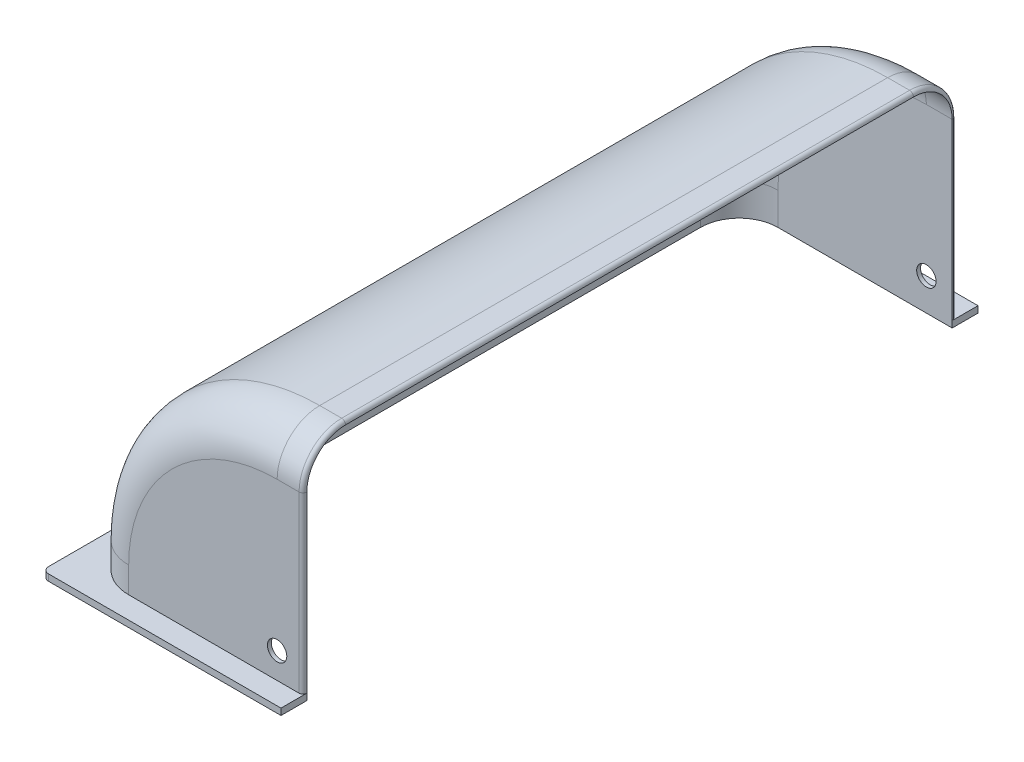
ISO-10303-21;
HEADER;
FILE_DESCRIPTION(('STEP AP214'),'2;1');
FILE_NAME('part.step','',(''),(''),'','','');
FILE_SCHEMA(('AUTOMOTIVE_DESIGN { 1 0 10303 214 1 1 1 1 }'));
ENDSEC;
DATA;
#1=APPLICATION_CONTEXT('core data for automotive mechanical design processes');
#2=APPLICATION_PROTOCOL_DEFINITION('international standard','automotive_design',2000,#1);
#3=PRODUCT_CONTEXT('',#1,'mechanical');
#4=PRODUCT('Part','Part','',(#3));
#5=PRODUCT_RELATED_PRODUCT_CATEGORY('part','',(#4));
#6=PRODUCT_DEFINITION_FORMATION('','',#4);
#7=PRODUCT_DEFINITION_CONTEXT('part definition',#1,'design');
#8=PRODUCT_DEFINITION('design','',#6,#7);
#9=PRODUCT_DEFINITION_SHAPE('','',#8);
#10=(LENGTH_UNIT() NAMED_UNIT(*) SI_UNIT(.MILLI.,.METRE.));
#11=(NAMED_UNIT(*) PLANE_ANGLE_UNIT() SI_UNIT($,.RADIAN.));
#12=(NAMED_UNIT(*) SI_UNIT($,.STERADIAN.) SOLID_ANGLE_UNIT());
#13=UNCERTAINTY_MEASURE_WITH_UNIT(LENGTH_MEASURE(1.E-05),#10,'distance_accuracy_value','');
#14=(GEOMETRIC_REPRESENTATION_CONTEXT(3) GLOBAL_UNCERTAINTY_ASSIGNED_CONTEXT((#13)) GLOBAL_UNIT_ASSIGNED_CONTEXT((#10,
#11,#12)) REPRESENTATION_CONTEXT('',''));
#15=CARTESIAN_POINT('',(0.,0.,0.));
#16=DIRECTION('',(0.,0.,1.));
#17=DIRECTION('',(1.,0.,0.));
#18=AXIS2_PLACEMENT_3D('',#15,#16,#17);
#19=CARTESIAN_POINT('',(20.,139.999999999984,-220.));
#20=DIRECTION('',(1.,0.,0.));
#21=DIRECTION('',(0.,0.,-1.));
#22=AXIS2_PLACEMENT_3D('',#19,#20,#21);
#23=PLANE('',#22);
#24=DIRECTION('',(0.,0.,1.));
#25=VECTOR('',#24,1.);
#26=CARTESIAN_POINT('',(20.,5.,-270.));
#27=LINE('',#26,#25);
#28=CARTESIAN_POINT('',(20.,5.,-270.));
#29=VERTEX_POINT('',#28);
#30=CARTESIAN_POINT('',(20.,5.,-250.));
#31=VERTEX_POINT('',#30);
#32=EDGE_CURVE('E217',#29,#31,#27,.T.);
#33=ORIENTED_EDGE('',*,*,#32,.T.);
#34=DIRECTION('',(0.,-1.,0.));
#35=VECTOR('',#34,1.);
#36=CARTESIAN_POINT('',(20.,24.9999999999842,-249.999999999999));
#37=LINE('',#36,#35);
#38=CARTESIAN_POINT('',(20.,0.,-250.));
#39=VERTEX_POINT('',#38);
#40=EDGE_CURVE('E210',#31,#39,#37,.T.);
#41=ORIENTED_EDGE('',*,*,#40,.T.);
#42=DIRECTION('',(0.,0.,-1.));
#43=VECTOR('',#42,1.);
#44=CARTESIAN_POINT('',(20.,0.,-250.));
#45=LINE('',#44,#43);
#46=CARTESIAN_POINT('',(20.,0.,-270.));
#47=VERTEX_POINT('',#46);
#48=EDGE_CURVE('E214',#39,#47,#45,.T.);
#49=ORIENTED_EDGE('',*,*,#48,.T.);
#50=DIRECTION('',(0.,1.,0.));
#51=VECTOR('',#50,1.);
#52=CARTESIAN_POINT('',(20.,0.,-270.));
#53=LINE('',#52,#51);
#54=EDGE_CURVE('E238',#47,#29,#53,.T.);
#55=ORIENTED_EDGE('',*,*,#54,.T.);
#56=EDGE_LOOP('',(#33,#41,#49,#55));
#57=FACE_BOUND('',#56,.T.);
#58=ADVANCED_FACE('F41',(#57),#23,.T.);
#59=CARTESIAN_POINT('',(-145.,5.,-250.));
#60=DIRECTION('',(0.,0.,-1.));
#61=DIRECTION('',(-1.,0.,0.));
#62=AXIS2_PLACEMENT_3D('',#59,#60,#61);
#63=PLANE('',#62);
#64=CARTESIAN_POINT('',(0.,25.,-250.));
#65=DIRECTION('',(0.,0.,-1.));
#66=DIRECTION('',(-1.,0.,0.));
#67=AXIS2_PLACEMENT_3D('',#64,#65,#66);
#68=CIRCLE('',#67,7.5);
#69=CARTESIAN_POINT('',(-7.5,25.,-250.));
#70=VERTEX_POINT('',#69);
#71=EDGE_CURVE('E223',#70,#70,#68,.T.);
#72=ORIENTED_EDGE('',*,*,#71,.T.);
#73=EDGE_LOOP('',(#72));
#74=FACE_BOUND('',#73,.T.);
#75=DIRECTION('',(1.,0.,0.));
#76=VECTOR('',#75,1.);
#77=CARTESIAN_POINT('',(-145.,0.,-250.));
#78=LINE('',#77,#76);
#79=CARTESIAN_POINT('',(-115.,0.,-250.));
#80=VERTEX_POINT('',#79);
#81=EDGE_CURVE('E227',#80,#39,#78,.T.);
#82=ORIENTED_EDGE('',*,*,#81,.T.);
#83=ORIENTED_EDGE('',*,*,#40,.F.);
#84=CARTESIAN_POINT('',(20.,140.000000000002,-249.999999999999));
#85=VERTEX_POINT('',#84);
#86=EDGE_CURVE('E222',#85,#31,#37,.T.);
#87=ORIENTED_EDGE('',*,*,#86,.F.);
#88=DIRECTION('',(-1.,0.,0.));
#89=VECTOR('',#88,1.);
#90=CARTESIAN_POINT('',(20.,140.000000000002,-249.999999999999));
#91=LINE('',#90,#89);
#92=CARTESIAN_POINT('',(4.02455846426619E-13,140.,-250.));
#93=VERTEX_POINT('',#92);
#94=EDGE_CURVE('E266',#85,#93,#91,.T.);
#95=ORIENTED_EDGE('',*,*,#94,.T.);
#96=CARTESIAN_POINT('',(0.,25.,-250.));
#97=DIRECTION('',(0.,0.,1.));
#98=DIRECTION('',(1.,0.,0.));
#99=AXIS2_PLACEMENT_3D('',#96,#97,#98);
#100=CIRCLE('',#99,115.);
#101=CARTESIAN_POINT('',(-115.,25.,-250.));
#102=VERTEX_POINT('',#101);
#103=EDGE_CURVE('E304',#93,#102,#100,.T.);
#104=ORIENTED_EDGE('',*,*,#103,.T.);
#105=DIRECTION('',(0.,-1.,0.));
#106=VECTOR('',#105,1.);
#107=CARTESIAN_POINT('',(-115.,0.,-250.));
#108=LINE('',#107,#106);
#109=EDGE_CURVE('E230',#102,#80,#108,.T.);
#110=ORIENTED_EDGE('',*,*,#109,.T.);
#111=EDGE_LOOP('',(#82,#83,#87,#95,#104,#110));
#112=FACE_BOUND('',#111,.T.);
#113=ADVANCED_FACE('F228',(#74,#112),#63,.F.);
#114=CARTESIAN_POINT('',(-165.,5.,-270.));
#115=DIRECTION('',(0.,0.,1.));
#116=DIRECTION('',(1.,0.,0.));
#117=AXIS2_PLACEMENT_3D('',#114,#115,#116);
#118=PLANE('',#117);
#119=DIRECTION('',(-1.,0.,0.));
#120=VECTOR('',#119,1.);
#121=CARTESIAN_POINT('',(-165.,0.,-270.));
#122=LINE('',#121,#120);
#123=CARTESIAN_POINT('',(-160.,0.,-270.));
#124=VERTEX_POINT('',#123);
#125=EDGE_CURVE('E232',#47,#124,#122,.T.);
#126=ORIENTED_EDGE('',*,*,#125,.T.);
#127=DIRECTION('',(0.,-1.,0.));
#128=VECTOR('',#127,1.);
#129=CARTESIAN_POINT('',(-160.,5.,-270.));
#130=LINE('',#129,#128);
#131=CARTESIAN_POINT('',(-160.,5.,-270.));
#132=VERTEX_POINT('',#131);
#133=EDGE_CURVE('E407',#124,#132,#130,.F.);
#134=ORIENTED_EDGE('',*,*,#133,.T.);
#135=DIRECTION('',(-1.,0.,0.));
#136=VECTOR('',#135,1.);
#137=CARTESIAN_POINT('',(-165.,5.,-270.));
#138=LINE('',#137,#136);
#139=EDGE_CURVE('E339',#29,#132,#138,.T.);
#140=ORIENTED_EDGE('',*,*,#139,.F.);
#141=ORIENTED_EDGE('',*,*,#54,.F.);
#142=EDGE_LOOP('',(#126,#134,#140,#141));
#143=FACE_BOUND('',#142,.T.);
#144=ADVANCED_FACE('F470',(#143),#118,.F.);
#145=CARTESIAN_POINT('',(-165.,5.,-270.));
#146=DIRECTION('',(1.,0.,0.));
#147=DIRECTION('',(0.,0.,-1.));
#148=AXIS2_PLACEMENT_3D('',#145,#146,#147);
#149=PLANE('',#148);
#150=DIRECTION('',(0.,0.,1.));
#151=VECTOR('',#150,1.);
#152=CARTESIAN_POINT('',(-165.,5.,-270.));
#153=LINE('',#152,#151);
#154=CARTESIAN_POINT('',(-165.,5.,-265.));
#155=VERTEX_POINT('',#154);
#156=CARTESIAN_POINT('',(-165.,5.,265.));
#157=VERTEX_POINT('',#156);
#158=EDGE_CURVE('E342',#155,#157,#153,.T.);
#159=ORIENTED_EDGE('',*,*,#158,.F.);
#160=DIRECTION('',(0.,-1.,0.));
#161=VECTOR('',#160,1.);
#162=CARTESIAN_POINT('',(-165.,5.,-265.));
#163=LINE('',#162,#161);
#164=CARTESIAN_POINT('',(-165.,0.,-265.));
#165=VERTEX_POINT('',#164);
#166=EDGE_CURVE('E400',#155,#165,#163,.T.);
#167=ORIENTED_EDGE('',*,*,#166,.T.);
#168=DIRECTION('',(0.,0.,1.));
#169=VECTOR('',#168,1.);
#170=CARTESIAN_POINT('',(-165.,0.,-270.));
#171=LINE('',#170,#169);
#172=CARTESIAN_POINT('',(-165.,0.,265.));
#173=VERTEX_POINT('',#172);
#174=EDGE_CURVE('E349',#165,#173,#171,.T.);
#175=ORIENTED_EDGE('',*,*,#174,.T.);
#176=DIRECTION('',(0.,-1.,0.));
#177=VECTOR('',#176,1.);
#178=CARTESIAN_POINT('',(-165.,5.,265.));
#179=LINE('',#178,#177);
#180=EDGE_CURVE('E398',#173,#157,#179,.F.);
#181=ORIENTED_EDGE('',*,*,#180,.T.);
#182=EDGE_LOOP('',(#159,#167,#175,#181));
#183=FACE_BOUND('',#182,.T.);
#184=ADVANCED_FACE('F733',(#183),#149,.F.);
#185=CARTESIAN_POINT('',(-165.,5.,270.));
#186=DIRECTION('',(0.,0.,-1.));
#187=DIRECTION('',(-1.,0.,0.));
#188=AXIS2_PLACEMENT_3D('',#185,#186,#187);
#189=PLANE('',#188);
#190=DIRECTION('',(1.,0.,0.));
#191=VECTOR('',#190,1.);
#192=CARTESIAN_POINT('',(-165.,5.,270.));
#193=LINE('',#192,#191);
#194=CARTESIAN_POINT('',(-160.,5.,270.));
#195=VERTEX_POINT('',#194);
#196=CARTESIAN_POINT('',(20.,5.,270.));
#197=VERTEX_POINT('',#196);
#198=EDGE_CURVE('E346',#195,#197,#193,.T.);
#199=ORIENTED_EDGE('',*,*,#198,.F.);
#200=DIRECTION('',(0.,-1.,0.));
#201=VECTOR('',#200,1.);
#202=CARTESIAN_POINT('',(-160.,5.,270.));
#203=LINE('',#202,#201);
#204=CARTESIAN_POINT('',(-160.,0.,270.));
#205=VERTEX_POINT('',#204);
#206=EDGE_CURVE('E413',#195,#205,#203,.T.);
#207=ORIENTED_EDGE('',*,*,#206,.T.);
#208=DIRECTION('',(1.,0.,0.));
#209=VECTOR('',#208,1.);
#210=CARTESIAN_POINT('',(-165.,0.,270.));
#211=LINE('',#210,#209);
#212=CARTESIAN_POINT('',(20.,0.,270.));
#213=VERTEX_POINT('',#212);
#214=EDGE_CURVE('E352',#205,#213,#211,.T.);
#215=ORIENTED_EDGE('',*,*,#214,.T.);
#216=DIRECTION('',(0.,-1.,0.));
#217=VECTOR('',#216,1.);
#218=CARTESIAN_POINT('',(20.,0.,270.));
#219=LINE('',#218,#217);
#220=EDGE_CURVE('E247',#197,#213,#219,.T.);
#221=ORIENTED_EDGE('',*,*,#220,.F.);
#222=EDGE_LOOP('',(#199,#207,#215,#221));
#223=FACE_BOUND('',#222,.T.);
#224=ADVANCED_FACE('F724',(#223),#189,.F.);
#225=CARTESIAN_POINT('',(-145.,5.,250.));
#226=DIRECTION('',(0.,0.,1.));
#227=DIRECTION('',(1.,0.,0.));
#228=AXIS2_PLACEMENT_3D('',#225,#226,#227);
#229=PLANE('',#228);
#230=CARTESIAN_POINT('',(0.,25.,250.));
#231=DIRECTION('',(0.,0.,1.));
#232=DIRECTION('',(1.,0.,0.));
#233=AXIS2_PLACEMENT_3D('',#230,#231,#232);
#234=CIRCLE('',#233,7.5);
#235=CARTESIAN_POINT('',(7.5,25.,250.));
#236=VERTEX_POINT('',#235);
#237=EDGE_CURVE('E444',#236,#236,#234,.T.);
#238=ORIENTED_EDGE('',*,*,#237,.T.);
#239=EDGE_LOOP('',(#238));
#240=FACE_BOUND('',#239,.T.);
#241=DIRECTION('',(-1.,0.,0.));
#242=VECTOR('',#241,1.);
#243=CARTESIAN_POINT('',(-145.,0.,250.));
#244=LINE('',#243,#242);
#245=CARTESIAN_POINT('',(20.,0.,250.));
#246=VERTEX_POINT('',#245);
#247=CARTESIAN_POINT('',(-115.,0.,250.));
#248=VERTEX_POINT('',#247);
#249=EDGE_CURVE('E354',#246,#248,#244,.T.);
#250=ORIENTED_EDGE('',*,*,#249,.T.);
#251=DIRECTION('',(0.,-1.,0.));
#252=VECTOR('',#251,1.);
#253=CARTESIAN_POINT('',(-115.,25.,250.));
#254=LINE('',#253,#252);
#255=CARTESIAN_POINT('',(-115.,25.,250.));
#256=VERTEX_POINT('',#255);
#257=EDGE_CURVE('E365',#248,#256,#254,.F.);
#258=ORIENTED_EDGE('',*,*,#257,.T.);
#259=CARTESIAN_POINT('',(0.,25.,250.));
#260=DIRECTION('',(0.,0.,1.));
#261=DIRECTION('',(1.,0.,0.));
#262=AXIS2_PLACEMENT_3D('',#259,#260,#261);
#263=CIRCLE('',#262,115.);
#264=CARTESIAN_POINT('',(4.02455846426619E-13,140.,250.));
#265=VERTEX_POINT('',#264);
#266=EDGE_CURVE('E312',#265,#256,#263,.T.);
#267=ORIENTED_EDGE('',*,*,#266,.F.);
#268=DIRECTION('',(-1.,0.,0.));
#269=VECTOR('',#268,1.);
#270=CARTESIAN_POINT('',(20.,140.000000000002,250.));
#271=LINE('',#270,#269);
#272=CARTESIAN_POINT('',(20.,140.000000000002,250.));
#273=VERTEX_POINT('',#272);
#274=EDGE_CURVE('E275',#273,#265,#271,.T.);
#275=ORIENTED_EDGE('',*,*,#274,.F.);
#276=DIRECTION('',(0.,1.,0.));
#277=VECTOR('',#276,1.);
#278=CARTESIAN_POINT('',(20.,24.9999999999974,250.));
#279=LINE('',#278,#277);
#280=CARTESIAN_POINT('',(20.,5.,250.));
#281=VERTEX_POINT('',#280);
#282=EDGE_CURVE('E253',#281,#273,#279,.T.);
#283=ORIENTED_EDGE('',*,*,#282,.F.);
#284=EDGE_CURVE('E254',#246,#281,#279,.T.);
#285=ORIENTED_EDGE('',*,*,#284,.F.);
#286=EDGE_LOOP('',(#250,#258,#267,#275,#283,#285));
#287=FACE_BOUND('',#286,.T.);
#288=ADVANCED_FACE('F716',(#240,#287),#229,.F.);
#289=CARTESIAN_POINT('',(-145.,5.,250.));
#290=DIRECTION('',(-1.,0.,0.));
#291=DIRECTION('',(0.,0.,1.));
#292=AXIS2_PLACEMENT_3D('',#289,#290,#291);
#293=PLANE('',#292);
#294=DIRECTION('',(0.,0.,-1.));
#295=VECTOR('',#294,1.);
#296=CARTESIAN_POINT('',(-145.,0.,250.));
#297=LINE('',#296,#295);
#298=CARTESIAN_POINT('',(-145.,0.,220.));
#299=VERTEX_POINT('',#298);
#300=CARTESIAN_POINT('',(-145.,0.,-220.));
#301=VERTEX_POINT('',#300);
#302=EDGE_CURVE('E343',#299,#301,#297,.T.);
#303=ORIENTED_EDGE('',*,*,#302,.T.);
#304=DIRECTION('',(0.,-1.,0.));
#305=VECTOR('',#304,1.);
#306=CARTESIAN_POINT('',(-145.,25.,-220.));
#307=LINE('',#306,#305);
#308=CARTESIAN_POINT('',(-145.,25.,-220.));
#309=VERTEX_POINT('',#308);
#310=EDGE_CURVE('E363',#301,#309,#307,.F.);
#311=ORIENTED_EDGE('',*,*,#310,.T.);
#312=DIRECTION('',(0.,0.,-1.));
#313=VECTOR('',#312,1.);
#314=CARTESIAN_POINT('',(-145.,25.,-250.));
#315=LINE('',#314,#313);
#316=CARTESIAN_POINT('',(-145.,25.,220.));
#317=VERTEX_POINT('',#316);
#318=EDGE_CURVE('E233',#317,#309,#315,.T.);
#319=ORIENTED_EDGE('',*,*,#318,.F.);
#320=DIRECTION('',(0.,-1.,0.));
#321=VECTOR('',#320,1.);
#322=CARTESIAN_POINT('',(-145.,0.,220.));
#323=LINE('',#322,#321);
#324=EDGE_CURVE('E360',#317,#299,#323,.T.);
#325=ORIENTED_EDGE('',*,*,#324,.T.);
#326=EDGE_LOOP('',(#303,#311,#319,#325));
#327=FACE_BOUND('',#326,.T.);
#328=ADVANCED_FACE('F536',(#327),#293,.F.);
#329=CARTESIAN_POINT('',(0.,5.,0.));
#330=DIRECTION('',(0.,1.,0.));
#331=DIRECTION('',(0.,0.,1.));
#332=AXIS2_PLACEMENT_3D('',#329,#330,#331);
#333=PLANE('',#332);
#334=ORIENTED_EDGE('',*,*,#139,.T.);
#335=CARTESIAN_POINT('',(-160.,5.,-265.));
#336=DIRECTION('',(0.,1.,0.));
#337=DIRECTION('',(0.,0.,1.));
#338=AXIS2_PLACEMENT_3D('',#335,#336,#337);
#339=CIRCLE('',#338,5.);
#340=EDGE_CURVE('E411',#132,#155,#339,.T.);
#341=ORIENTED_EDGE('',*,*,#340,.T.);
#342=ORIENTED_EDGE('',*,*,#158,.T.);
#343=CARTESIAN_POINT('',(-160.,5.,265.));
#344=DIRECTION('',(0.,1.,0.));
#345=DIRECTION('',(0.,0.,1.));
#346=AXIS2_PLACEMENT_3D('',#343,#344,#345);
#347=CIRCLE('',#346,5.);
#348=EDGE_CURVE('E409',#157,#195,#347,.T.);
#349=ORIENTED_EDGE('',*,*,#348,.T.);
#350=ORIENTED_EDGE('',*,*,#198,.T.);
#351=DIRECTION('',(0.,0.,1.));
#352=VECTOR('',#351,1.);
#353=CARTESIAN_POINT('',(20.,5.,270.));
#354=LINE('',#353,#352);
#355=EDGE_CURVE('E244',#281,#197,#354,.T.);
#356=ORIENTED_EDGE('',*,*,#355,.F.);
#357=CARTESIAN_POINT('',(17.,5.,250.));
#358=DIRECTION('',(0.,1.,0.));
#359=DIRECTION('',(0.,0.,1.));
#360=AXIS2_PLACEMENT_3D('',#357,#358,#359);
#361=CIRCLE('',#360,3.);
#362=CARTESIAN_POINT('',(17.,5.,253.));
#363=VERTEX_POINT('',#362);
#364=EDGE_CURVE('E11',#281,#363,#361,.F.);
#365=ORIENTED_EDGE('',*,*,#364,.T.);
#366=DIRECTION('',(1.,0.,0.));
#367=VECTOR('',#366,1.);
#368=CARTESIAN_POINT('',(-1.11022302462516E-13,5.,253.));
#369=LINE('',#368,#367);
#370=CARTESIAN_POINT('',(-115.,5.,253.));
#371=VERTEX_POINT('',#370);
#372=EDGE_CURVE('E331',#371,#363,#369,.T.);
#373=ORIENTED_EDGE('',*,*,#372,.F.);
#374=CARTESIAN_POINT('',(-115.,5.,220.));
#375=DIRECTION('',(0.,1.,0.));
#376=DIRECTION('',(0.,0.,1.));
#377=AXIS2_PLACEMENT_3D('',#374,#375,#376);
#378=CIRCLE('',#377,33.);
#379=CARTESIAN_POINT('',(-148.,5.,220.));
#380=VERTEX_POINT('',#379);
#381=EDGE_CURVE('E393',#371,#380,#378,.F.);
#382=ORIENTED_EDGE('',*,*,#381,.T.);
#383=DIRECTION('',(0.,0.,1.));
#384=VECTOR('',#383,1.);
#385=CARTESIAN_POINT('',(-148.,5.,-253.));
#386=LINE('',#385,#384);
#387=CARTESIAN_POINT('',(-148.,5.,-220.));
#388=VERTEX_POINT('',#387);
#389=EDGE_CURVE('E335',#388,#380,#386,.T.);
#390=ORIENTED_EDGE('',*,*,#389,.F.);
#391=CARTESIAN_POINT('',(-115.,5.,-220.));
#392=DIRECTION('',(0.,1.,0.));
#393=DIRECTION('',(0.,0.,1.));
#394=AXIS2_PLACEMENT_3D('',#391,#392,#393);
#395=CIRCLE('',#394,33.);
#396=CARTESIAN_POINT('',(-115.,5.,-253.));
#397=VERTEX_POINT('',#396);
#398=EDGE_CURVE('E395',#388,#397,#395,.F.);
#399=ORIENTED_EDGE('',*,*,#398,.T.);
#400=DIRECTION('',(-1.,0.,0.));
#401=VECTOR('',#400,1.);
#402=CARTESIAN_POINT('',(-1.11022302462516E-13,5.,-253.));
#403=LINE('',#402,#401);
#404=CARTESIAN_POINT('',(17.,5.,-253.));
#405=VERTEX_POINT('',#404);
#406=EDGE_CURVE('E327',#405,#397,#403,.T.);
#407=ORIENTED_EDGE('',*,*,#406,.F.);
#408=CARTESIAN_POINT('',(17.,5.,-250.));
#409=DIRECTION('',(0.,1.,0.));
#410=DIRECTION('',(0.,0.,1.));
#411=AXIS2_PLACEMENT_3D('',#408,#409,#410);
#412=CIRCLE('',#411,3.);
#413=EDGE_CURVE('E50',#405,#31,#412,.F.);
#414=ORIENTED_EDGE('',*,*,#413,.T.);
#415=ORIENTED_EDGE('',*,*,#32,.F.);
#416=EDGE_LOOP('',(#334,#341,#342,#349,#350,#356,#365,#373,#382,#390,#399,#407,#414,#415));
#417=FACE_BOUND('',#416,.T.);
#418=ADVANCED_FACE('F491',(#417),#333,.T.);
#419=CARTESIAN_POINT('',(0.,0.,0.));
#420=DIRECTION('',(0.,1.,0.));
#421=DIRECTION('',(0.,0.,1.));
#422=AXIS2_PLACEMENT_3D('',#419,#420,#421);
#423=PLANE('',#422);
#424=ORIENTED_EDGE('',*,*,#174,.F.);
#425=CARTESIAN_POINT('',(-160.,0.,-265.));
#426=DIRECTION('',(0.,1.,0.));
#427=DIRECTION('',(0.,0.,1.));
#428=AXIS2_PLACEMENT_3D('',#425,#426,#427);
#429=CIRCLE('',#428,5.);
#430=EDGE_CURVE('E405',#165,#124,#429,.F.);
#431=ORIENTED_EDGE('',*,*,#430,.T.);
#432=ORIENTED_EDGE('',*,*,#125,.F.);
#433=ORIENTED_EDGE('',*,*,#48,.F.);
#434=ORIENTED_EDGE('',*,*,#81,.F.);
#435=CARTESIAN_POINT('',(-115.,0.,-220.));
#436=DIRECTION('',(0.,1.,0.));
#437=DIRECTION('',(0.,0.,1.));
#438=AXIS2_PLACEMENT_3D('',#435,#436,#437);
#439=CIRCLE('',#438,30.);
#440=EDGE_CURVE('E367',#80,#301,#439,.T.);
#441=ORIENTED_EDGE('',*,*,#440,.T.);
#442=ORIENTED_EDGE('',*,*,#302,.F.);
#443=CARTESIAN_POINT('',(-115.,0.,220.));
#444=DIRECTION('',(0.,1.,0.));
#445=DIRECTION('',(0.,0.,1.));
#446=AXIS2_PLACEMENT_3D('',#443,#444,#445);
#447=CIRCLE('',#446,30.);
#448=EDGE_CURVE('E372',#299,#248,#447,.T.);
#449=ORIENTED_EDGE('',*,*,#448,.T.);
#450=ORIENTED_EDGE('',*,*,#249,.F.);
#451=DIRECTION('',(0.,0.,-1.));
#452=VECTOR('',#451,1.);
#453=CARTESIAN_POINT('',(20.,0.,250.));
#454=LINE('',#453,#452);
#455=EDGE_CURVE('E250',#213,#246,#454,.T.);
#456=ORIENTED_EDGE('',*,*,#455,.F.);
#457=ORIENTED_EDGE('',*,*,#214,.F.);
#458=CARTESIAN_POINT('',(-160.,0.,265.));
#459=DIRECTION('',(0.,1.,0.));
#460=DIRECTION('',(0.,0.,1.));
#461=AXIS2_PLACEMENT_3D('',#458,#459,#460);
#462=CIRCLE('',#461,5.);
#463=EDGE_CURVE('E403',#205,#173,#462,.F.);
#464=ORIENTED_EDGE('',*,*,#463,.T.);
#465=EDGE_LOOP('',(#424,#431,#432,#433,#434,#441,#442,#449,#450,#456,#457,#464));
#466=FACE_BOUND('',#465,.T.);
#467=ADVANCED_FACE('F236',(#466),#423,.F.);
#468=CARTESIAN_POINT('',(-1.11022302462516E-13,25.,-253.));
#469=DIRECTION('',(0.,0.,1.));
#470=DIRECTION('',(1.,0.,0.));
#471=AXIS2_PLACEMENT_3D('',#468,#469,#470);
#472=PLANE('',#471);
#473=CARTESIAN_POINT('',(0.,25.,-253.));
#474=DIRECTION('',(0.,0.,1.));
#475=DIRECTION('',(1.,0.,0.));
#476=AXIS2_PLACEMENT_3D('',#473,#474,#475);
#477=CIRCLE('',#476,7.5);
#478=CARTESIAN_POINT('',(7.5,25.,-253.));
#479=VERTEX_POINT('',#478);
#480=EDGE_CURVE('E439',#479,#479,#477,.F.);
#481=ORIENTED_EDGE('',*,*,#480,.F.);
#482=EDGE_LOOP('',(#481));
#483=FACE_BOUND('',#482,.T.);
#484=DIRECTION('',(-1.,0.,0.));
#485=VECTOR('',#484,1.);
#486=CARTESIAN_POINT('',(20.,139.999999999984,-253.000000000002));
#487=LINE('',#486,#485);
#488=CARTESIAN_POINT('',(17.,139.999999999984,-253.000000000002));
#489=VERTEX_POINT('',#488);
#490=CARTESIAN_POINT('',(4.02455846426619E-13,140.,-253.));
#491=VERTEX_POINT('',#490);
#492=EDGE_CURVE('E284',#489,#491,#487,.T.);
#493=ORIENTED_EDGE('',*,*,#492,.F.);
#494=DIRECTION('',(0.,1.,0.));
#495=VECTOR('',#494,1.);
#496=CARTESIAN_POINT('',(17.,5.,-253.));
#497=LINE('',#496,#495);
#498=EDGE_CURVE('E416',#489,#405,#497,.F.);
#499=ORIENTED_EDGE('',*,*,#498,.T.);
#500=ORIENTED_EDGE('',*,*,#406,.T.);
#501=DIRECTION('',(0.,-1.,0.));
#502=VECTOR('',#501,1.);
#503=CARTESIAN_POINT('',(-115.,25.,-253.));
#504=LINE('',#503,#502);
#505=CARTESIAN_POINT('',(-115.,25.,-253.));
#506=VERTEX_POINT('',#505);
#507=EDGE_CURVE('E391',#397,#506,#504,.F.);
#508=ORIENTED_EDGE('',*,*,#507,.T.);
#509=CARTESIAN_POINT('',(0.,25.,-253.));
#510=DIRECTION('',(0.,0.,1.));
#511=DIRECTION('',(1.,0.,0.));
#512=AXIS2_PLACEMENT_3D('',#509,#510,#511);
#513=CIRCLE('',#512,115.);
#514=EDGE_CURVE('E324',#491,#506,#513,.T.);
#515=ORIENTED_EDGE('',*,*,#514,.F.);
#516=EDGE_LOOP('',(#493,#499,#500,#508,#515));
#517=FACE_BOUND('',#516,.T.);
#518=ADVANCED_FACE('F682',(#483,#517),#472,.F.);
#519=CARTESIAN_POINT('',(-148.,25.,-253.));
#520=DIRECTION('',(1.,0.,0.));
#521=DIRECTION('',(0.,0.,-1.));
#522=AXIS2_PLACEMENT_3D('',#519,#520,#521);
#523=PLANE('',#522);
#524=ORIENTED_EDGE('',*,*,#389,.T.);
#525=DIRECTION('',(0.,-1.,0.));
#526=VECTOR('',#525,1.);
#527=CARTESIAN_POINT('',(-148.,25.,220.));
#528=LINE('',#527,#526);
#529=CARTESIAN_POINT('',(-148.,25.,220.));
#530=VERTEX_POINT('',#529);
#531=EDGE_CURVE('E383',#380,#530,#528,.F.);
#532=ORIENTED_EDGE('',*,*,#531,.T.);
#533=DIRECTION('',(0.,0.,1.));
#534=VECTOR('',#533,1.);
#535=CARTESIAN_POINT('',(-148.,25.,-253.));
#536=LINE('',#535,#534);
#537=CARTESIAN_POINT('',(-148.,25.,-220.));
#538=VERTEX_POINT('',#537);
#539=EDGE_CURVE('E328',#538,#530,#536,.T.);
#540=ORIENTED_EDGE('',*,*,#539,.F.);
#541=DIRECTION('',(0.,-1.,0.));
#542=VECTOR('',#541,1.);
#543=CARTESIAN_POINT('',(-148.,25.,-220.));
#544=LINE('',#543,#542);
#545=EDGE_CURVE('E380',#538,#388,#544,.T.);
#546=ORIENTED_EDGE('',*,*,#545,.T.);
#547=EDGE_LOOP('',(#524,#532,#540,#546));
#548=FACE_BOUND('',#547,.T.);
#549=ADVANCED_FACE('F500',(#548),#523,.F.);
#550=CARTESIAN_POINT('',(-1.11022302462516E-13,25.,253.));
#551=DIRECTION('',(0.,0.,-1.));
#552=DIRECTION('',(-1.,0.,0.));
#553=AXIS2_PLACEMENT_3D('',#550,#551,#552);
#554=PLANE('',#553);
#555=CARTESIAN_POINT('',(0.,25.,253.));
#556=DIRECTION('',(0.,0.,1.));
#557=DIRECTION('',(1.,0.,0.));
#558=AXIS2_PLACEMENT_3D('',#555,#556,#557);
#559=CIRCLE('',#558,7.5);
#560=CARTESIAN_POINT('',(7.5,25.,253.));
#561=VERTEX_POINT('',#560);
#562=EDGE_CURVE('E435',#561,#561,#559,.T.);
#563=ORIENTED_EDGE('',*,*,#562,.F.);
#564=EDGE_LOOP('',(#563));
#565=FACE_BOUND('',#564,.T.);
#566=ORIENTED_EDGE('',*,*,#372,.T.);
#567=DIRECTION('',(0.,-1.,0.));
#568=VECTOR('',#567,1.);
#569=CARTESIAN_POINT('',(17.,139.999999999998,253.));
#570=LINE('',#569,#568);
#571=CARTESIAN_POINT('',(17.,139.999999999998,253.));
#572=VERTEX_POINT('',#571);
#573=EDGE_CURVE('E66',#363,#572,#570,.F.);
#574=ORIENTED_EDGE('',*,*,#573,.T.);
#575=DIRECTION('',(-1.,0.,0.));
#576=VECTOR('',#575,1.);
#577=CARTESIAN_POINT('',(20.,139.999999999998,253.));
#578=LINE('',#577,#576);
#579=CARTESIAN_POINT('',(4.02455846426619E-13,140.,253.));
#580=VERTEX_POINT('',#579);
#581=EDGE_CURVE('E278',#572,#580,#578,.T.);
#582=ORIENTED_EDGE('',*,*,#581,.T.);
#583=CARTESIAN_POINT('',(0.,25.,253.));
#584=DIRECTION('',(0.,0.,1.));
#585=DIRECTION('',(1.,0.,0.));
#586=AXIS2_PLACEMENT_3D('',#583,#584,#585);
#587=CIRCLE('',#586,115.);
#588=CARTESIAN_POINT('',(-115.,25.,253.));
#589=VERTEX_POINT('',#588);
#590=EDGE_CURVE('E315',#580,#589,#587,.T.);
#591=ORIENTED_EDGE('',*,*,#590,.T.);
#592=DIRECTION('',(0.,-1.,0.));
#593=VECTOR('',#592,1.);
#594=CARTESIAN_POINT('',(-115.,25.,253.));
#595=LINE('',#594,#593);
#596=EDGE_CURVE('E377',#589,#371,#595,.T.);
#597=ORIENTED_EDGE('',*,*,#596,.T.);
#598=EDGE_LOOP('',(#566,#574,#582,#591,#597));
#599=FACE_BOUND('',#598,.T.);
#600=ADVANCED_FACE('F492',(#565,#599),#554,.F.);
#601=CARTESIAN_POINT('',(-115.,5.,-220.));
#602=DIRECTION('',(0.,1.,0.));
#603=DIRECTION('',(0.,0.,1.));
#604=AXIS2_PLACEMENT_3D('',#601,#602,#603);
#605=CYLINDRICAL_SURFACE('',#604,30.);
#606=CARTESIAN_POINT('',(-115.,25.,-220.));
#607=DIRECTION('',(0.,-1.,0.));
#608=DIRECTION('',(0.,0.,-1.));
#609=AXIS2_PLACEMENT_3D('',#606,#607,#608);
#610=CIRCLE('',#609,30.);
#611=EDGE_CURVE('E369',#309,#102,#610,.T.);
#612=ORIENTED_EDGE('',*,*,#611,.F.);
#613=ORIENTED_EDGE('',*,*,#310,.F.);
#614=ORIENTED_EDGE('',*,*,#440,.F.);
#615=ORIENTED_EDGE('',*,*,#109,.F.);
#616=EDGE_LOOP('',(#612,#613,#614,#615));
#617=FACE_BOUND('',#616,.T.);
#618=ADVANCED_FACE('F540',(#617),#605,.F.);
#619=CARTESIAN_POINT('',(-115.,5.,220.));
#620=DIRECTION('',(0.,1.,0.));
#621=DIRECTION('',(0.,0.,1.));
#622=AXIS2_PLACEMENT_3D('',#619,#620,#621);
#623=CYLINDRICAL_SURFACE('',#622,30.);
#624=CARTESIAN_POINT('',(-115.,25.,220.));
#625=DIRECTION('',(0.,-1.,0.));
#626=DIRECTION('',(0.,0.,-1.));
#627=AXIS2_PLACEMENT_3D('',#624,#625,#626);
#628=CIRCLE('',#627,30.);
#629=EDGE_CURVE('E374',#256,#317,#628,.T.);
#630=ORIENTED_EDGE('',*,*,#629,.F.);
#631=ORIENTED_EDGE('',*,*,#257,.F.);
#632=ORIENTED_EDGE('',*,*,#448,.F.);
#633=ORIENTED_EDGE('',*,*,#324,.F.);
#634=EDGE_LOOP('',(#630,#631,#632,#633));
#635=FACE_BOUND('',#634,.T.);
#636=ADVANCED_FACE('F533',(#635),#623,.F.);
#637=CARTESIAN_POINT('',(-115.,25.,220.));
#638=DIRECTION('',(0.,-1.,0.));
#639=DIRECTION('',(0.,0.,-1.));
#640=AXIS2_PLACEMENT_3D('',#637,#638,#639);
#641=CYLINDRICAL_SURFACE('',#640,33.);
#642=CARTESIAN_POINT('',(-115.,25.,220.));
#643=DIRECTION('',(0.,-1.,0.));
#644=DIRECTION('',(0.,0.,-1.));
#645=AXIS2_PLACEMENT_3D('',#642,#643,#644);
#646=CIRCLE('',#645,33.);
#647=EDGE_CURVE('E388',#530,#589,#646,.F.);
#648=ORIENTED_EDGE('',*,*,#647,.F.);
#649=ORIENTED_EDGE('',*,*,#531,.F.);
#650=ORIENTED_EDGE('',*,*,#381,.F.);
#651=ORIENTED_EDGE('',*,*,#596,.F.);
#652=EDGE_LOOP('',(#648,#649,#650,#651));
#653=FACE_BOUND('',#652,.T.);
#654=ADVANCED_FACE('F496',(#653),#641,.T.);
#655=CARTESIAN_POINT('',(-115.,25.,-220.));
#656=DIRECTION('',(0.,-1.,0.));
#657=DIRECTION('',(0.,0.,-1.));
#658=AXIS2_PLACEMENT_3D('',#655,#656,#657);
#659=CYLINDRICAL_SURFACE('',#658,33.);
#660=CARTESIAN_POINT('',(-115.,25.,-220.));
#661=DIRECTION('',(0.,-1.,0.));
#662=DIRECTION('',(0.,0.,-1.));
#663=AXIS2_PLACEMENT_3D('',#660,#661,#662);
#664=CIRCLE('',#663,33.);
#665=EDGE_CURVE('E385',#506,#538,#664,.F.);
#666=ORIENTED_EDGE('',*,*,#665,.F.);
#667=ORIENTED_EDGE('',*,*,#507,.F.);
#668=ORIENTED_EDGE('',*,*,#398,.F.);
#669=ORIENTED_EDGE('',*,*,#545,.F.);
#670=EDGE_LOOP('',(#666,#667,#668,#669));
#671=FACE_BOUND('',#670,.T.);
#672=ADVANCED_FACE('F504',(#671),#659,.T.);
#673=CARTESIAN_POINT('',(-160.,5.,-265.));
#674=DIRECTION('',(0.,-1.,0.));
#675=DIRECTION('',(0.,0.,-1.));
#676=AXIS2_PLACEMENT_3D('',#673,#674,#675);
#677=CYLINDRICAL_SURFACE('',#676,5.);
#678=ORIENTED_EDGE('',*,*,#340,.F.);
#679=ORIENTED_EDGE('',*,*,#133,.F.);
#680=ORIENTED_EDGE('',*,*,#430,.F.);
#681=ORIENTED_EDGE('',*,*,#166,.F.);
#682=EDGE_LOOP('',(#678,#679,#680,#681));
#683=FACE_BOUND('',#682,.T.);
#684=ADVANCED_FACE('F557',(#683),#677,.T.);
#685=CARTESIAN_POINT('',(-160.,5.,265.));
#686=DIRECTION('',(0.,-1.,0.));
#687=DIRECTION('',(0.,0.,-1.));
#688=AXIS2_PLACEMENT_3D('',#685,#686,#687);
#689=CYLINDRICAL_SURFACE('',#688,5.);
#690=ORIENTED_EDGE('',*,*,#348,.F.);
#691=ORIENTED_EDGE('',*,*,#180,.F.);
#692=ORIENTED_EDGE('',*,*,#463,.F.);
#693=ORIENTED_EDGE('',*,*,#206,.F.);
#694=EDGE_LOOP('',(#690,#691,#692,#693));
#695=FACE_BOUND('',#694,.T.);
#696=ADVANCED_FACE('F560',(#695),#689,.T.);
#697=CARTESIAN_POINT('',(0.,25.,-220.));
#698=DIRECTION('',(0.,0.,1.));
#699=DIRECTION('',(1.,0.,0.));
#700=AXIS2_PLACEMENT_3D('',#697,#698,#699);
#701=TOROIDAL_SURFACE('',#700,115.,32.9999999999999);
#702=CARTESIAN_POINT('',(0.,25.,-220.));
#703=DIRECTION('',(0.,0.,1.));
#704=DIRECTION('',(1.,0.,0.));
#705=AXIS2_PLACEMENT_3D('',#702,#703,#704);
#706=CIRCLE('',#705,148.);
#707=CARTESIAN_POINT('',(5.16947595841089E-13,173.,-220.));
#708=VERTEX_POINT('',#707);
#709=EDGE_CURVE('E321',#708,#538,#706,.T.);
#710=ORIENTED_EDGE('',*,*,#709,.F.);
#711=CARTESIAN_POINT('',(4.02455846426619E-13,140.,-220.));
#712=DIRECTION('',(1.,0.,0.));
#713=DIRECTION('',(0.,0.,1.));
#714=AXIS2_PLACEMENT_3D('',#711,#712,#713);
#715=CIRCLE('',#714,32.9999999999999);
#716=EDGE_CURVE('E286',#491,#708,#715,.T.);
#717=ORIENTED_EDGE('',*,*,#716,.F.);
#718=ORIENTED_EDGE('',*,*,#514,.T.);
#719=ORIENTED_EDGE('',*,*,#665,.T.);
#720=EDGE_LOOP('',(#710,#717,#718,#719));
#721=FACE_BOUND('',#720,.T.);
#722=ADVANCED_FACE('F564',(#721),#701,.T.);
#723=CARTESIAN_POINT('',(0.,25.,-250.));
#724=DIRECTION('',(0.,0.,1.));
#725=DIRECTION('',(1.,0.,0.));
#726=AXIS2_PLACEMENT_3D('',#723,#724,#725);
#727=CYLINDRICAL_SURFACE('',#726,148.);
#728=CARTESIAN_POINT('',(0.,25.,220.));
#729=DIRECTION('',(0.,0.,1.));
#730=DIRECTION('',(1.,0.,0.));
#731=AXIS2_PLACEMENT_3D('',#728,#729,#730);
#732=CIRCLE('',#731,148.);
#733=CARTESIAN_POINT('',(5.16947595841089E-13,173.,220.));
#734=VERTEX_POINT('',#733);
#735=EDGE_CURVE('E318',#734,#530,#732,.T.);
#736=ORIENTED_EDGE('',*,*,#735,.F.);
#737=DIRECTION('',(0.,0.,1.));
#738=VECTOR('',#737,1.);
#739=CARTESIAN_POINT('',(5.16947595841089E-13,173.,-220.));
#740=LINE('',#739,#738);
#741=EDGE_CURVE('E289',#708,#734,#740,.T.);
#742=ORIENTED_EDGE('',*,*,#741,.F.);
#743=ORIENTED_EDGE('',*,*,#709,.T.);
#744=ORIENTED_EDGE('',*,*,#539,.T.);
#745=EDGE_LOOP('',(#736,#742,#743,#744));
#746=FACE_BOUND('',#745,.T.);
#747=ADVANCED_FACE('F806',(#746),#727,.T.);
#748=CARTESIAN_POINT('',(0.,25.,220.));
#749=DIRECTION('',(0.,0.,1.));
#750=DIRECTION('',(1.,0.,0.));
#751=AXIS2_PLACEMENT_3D('',#748,#749,#750);
#752=TOROIDAL_SURFACE('',#751,115.,33.);
#753=ORIENTED_EDGE('',*,*,#590,.F.);
#754=CARTESIAN_POINT('',(4.02455846426619E-13,140.,220.));
#755=DIRECTION('',(1.,0.,0.));
#756=DIRECTION('',(0.,0.,-1.));
#757=AXIS2_PLACEMENT_3D('',#754,#755,#756);
#758=CIRCLE('',#757,33.);
#759=EDGE_CURVE('E292',#734,#580,#758,.T.);
#760=ORIENTED_EDGE('',*,*,#759,.F.);
#761=ORIENTED_EDGE('',*,*,#735,.T.);
#762=ORIENTED_EDGE('',*,*,#647,.T.);
#763=EDGE_LOOP('',(#753,#760,#761,#762));
#764=FACE_BOUND('',#763,.T.);
#765=ADVANCED_FACE('F815',(#764),#752,.T.);
#766=CARTESIAN_POINT('',(0.,25.,220.));
#767=DIRECTION('',(0.,0.,1.));
#768=DIRECTION('',(1.,0.,0.));
#769=AXIS2_PLACEMENT_3D('',#766,#767,#768);
#770=TOROIDAL_SURFACE('',#769,115.,30.);
#771=CARTESIAN_POINT('',(0.,25.,220.));
#772=DIRECTION('',(0.,0.,1.));
#773=DIRECTION('',(1.,0.,0.));
#774=AXIS2_PLACEMENT_3D('',#771,#772,#773);
#775=CIRCLE('',#774,145.);
#776=CARTESIAN_POINT('',(5.06539254985228E-13,170.,220.));
#777=VERTEX_POINT('',#776);
#778=EDGE_CURVE('E309',#777,#317,#775,.T.);
#779=ORIENTED_EDGE('',*,*,#778,.F.);
#780=CARTESIAN_POINT('',(4.02455846426619E-13,140.,220.));
#781=DIRECTION('',(-1.,0.,0.));
#782=DIRECTION('',(0.,0.,-1.));
#783=AXIS2_PLACEMENT_3D('',#780,#781,#782);
#784=CIRCLE('',#783,30.);
#785=EDGE_CURVE('E295',#265,#777,#784,.T.);
#786=ORIENTED_EDGE('',*,*,#785,.F.);
#787=ORIENTED_EDGE('',*,*,#266,.T.);
#788=ORIENTED_EDGE('',*,*,#629,.T.);
#789=EDGE_LOOP('',(#779,#786,#787,#788));
#790=FACE_BOUND('',#789,.T.);
#791=ADVANCED_FACE('F528',(#790),#770,.F.);
#792=CARTESIAN_POINT('',(0.,25.,-250.));
#793=DIRECTION('',(0.,0.,1.));
#794=DIRECTION('',(1.,0.,0.));
#795=AXIS2_PLACEMENT_3D('',#792,#793,#794);
#796=CYLINDRICAL_SURFACE('',#795,145.);
#797=CARTESIAN_POINT('',(0.,25.,-220.));
#798=DIRECTION('',(0.,0.,1.));
#799=DIRECTION('',(1.,0.,0.));
#800=AXIS2_PLACEMENT_3D('',#797,#798,#799);
#801=CIRCLE('',#800,145.);
#802=CARTESIAN_POINT('',(5.06539254985228E-13,170.,-220.));
#803=VERTEX_POINT('',#802);
#804=EDGE_CURVE('E306',#803,#309,#801,.T.);
#805=ORIENTED_EDGE('',*,*,#804,.F.);
#806=DIRECTION('',(0.,0.,-1.));
#807=VECTOR('',#806,1.);
#808=CARTESIAN_POINT('',(5.06539254985228E-13,170.,-220.));
#809=LINE('',#808,#807);
#810=EDGE_CURVE('E298',#777,#803,#809,.T.);
#811=ORIENTED_EDGE('',*,*,#810,.F.);
#812=ORIENTED_EDGE('',*,*,#778,.T.);
#813=ORIENTED_EDGE('',*,*,#318,.T.);
#814=EDGE_LOOP('',(#805,#811,#812,#813));
#815=FACE_BOUND('',#814,.T.);
#816=ADVANCED_FACE('F522',(#815),#796,.F.);
#817=CARTESIAN_POINT('',(0.,25.,-220.));
#818=DIRECTION('',(0.,0.,1.));
#819=DIRECTION('',(1.,0.,0.));
#820=AXIS2_PLACEMENT_3D('',#817,#818,#819);
#821=TOROIDAL_SURFACE('',#820,115.,30.);
#822=ORIENTED_EDGE('',*,*,#103,.F.);
#823=CARTESIAN_POINT('',(4.02455846426619E-13,140.,-220.));
#824=DIRECTION('',(-1.,0.,0.));
#825=DIRECTION('',(0.,0.,1.));
#826=AXIS2_PLACEMENT_3D('',#823,#824,#825);
#827=CIRCLE('',#826,30.);
#828=EDGE_CURVE('E301',#803,#93,#827,.T.);
#829=ORIENTED_EDGE('',*,*,#828,.F.);
#830=ORIENTED_EDGE('',*,*,#804,.T.);
#831=ORIENTED_EDGE('',*,*,#611,.T.);
#832=EDGE_LOOP('',(#822,#829,#830,#831));
#833=FACE_BOUND('',#832,.T.);
#834=ADVANCED_FACE('F517',(#833),#821,.F.);
#835=CARTESIAN_POINT('',(20.,139.999999999984,-220.));
#836=DIRECTION('',(-1.,0.,0.));
#837=DIRECTION('',(0.,0.,1.));
#838=AXIS2_PLACEMENT_3D('',#835,#836,#837);
#839=CYLINDRICAL_SURFACE('',#838,33.0000000000023);
#840=DIRECTION('',(-1.,0.,0.));
#841=VECTOR('',#840,1.);
#842=CARTESIAN_POINT('',(20.,172.999999999984,-220.));
#843=LINE('',#842,#841);
#844=CARTESIAN_POINT('',(17.,172.999999999984,-220.));
#845=VERTEX_POINT('',#844);
#846=EDGE_CURVE('E282',#845,#708,#843,.T.);
#847=ORIENTED_EDGE('',*,*,#846,.F.);
#848=CARTESIAN_POINT('',(17.,139.999999999984,-220.));
#849=DIRECTION('',(1.,0.,0.));
#850=DIRECTION('',(0.,0.,-1.));
#851=AXIS2_PLACEMENT_3D('',#848,#849,#850);
#852=CIRCLE('',#851,33.0000000000023);
#853=EDGE_CURVE('E418',#845,#489,#852,.F.);
#854=ORIENTED_EDGE('',*,*,#853,.T.);
#855=ORIENTED_EDGE('',*,*,#492,.T.);
#856=ORIENTED_EDGE('',*,*,#716,.T.);
#857=EDGE_LOOP('',(#847,#854,#855,#856));
#858=FACE_BOUND('',#857,.T.);
#859=ADVANCED_FACE('F655',(#858),#839,.T.);
#860=CARTESIAN_POINT('',(20.,172.999999999984,-220.));
#861=DIRECTION('',(0.,-1.,0.));
#862=DIRECTION('',(0.,0.,-1.));
#863=AXIS2_PLACEMENT_3D('',#860,#861,#862);
#864=PLANE('',#863);
#865=DIRECTION('',(-1.,0.,0.));
#866=VECTOR('',#865,1.);
#867=CARTESIAN_POINT('',(20.,172.999999999984,220.));
#868=LINE('',#867,#866);
#869=CARTESIAN_POINT('',(17.,172.999999999984,220.));
#870=VERTEX_POINT('',#869);
#871=EDGE_CURVE('E280',#870,#734,#868,.T.);
#872=ORIENTED_EDGE('',*,*,#871,.F.);
#873=DIRECTION('',(0.,0.,1.));
#874=VECTOR('',#873,1.);
#875=CARTESIAN_POINT('',(17.,172.999999999984,-220.));
#876=LINE('',#875,#874);
#877=EDGE_CURVE('E422',#870,#845,#876,.F.);
#878=ORIENTED_EDGE('',*,*,#877,.T.);
#879=ORIENTED_EDGE('',*,*,#846,.T.);
#880=ORIENTED_EDGE('',*,*,#741,.T.);
#881=EDGE_LOOP('',(#872,#878,#879,#880));
#882=FACE_BOUND('',#881,.T.);
#883=ADVANCED_FACE('F647',(#882),#864,.F.);
#884=CARTESIAN_POINT('',(20.,139.99999999998,219.999999999995));
#885=DIRECTION('',(-1.,0.,0.));
#886=DIRECTION('',(0.,0.,1.));
#887=AXIS2_PLACEMENT_3D('',#884,#885,#886);
#888=CYLINDRICAL_SURFACE('',#887,33.0000000000044);
#889=ORIENTED_EDGE('',*,*,#581,.F.);
#890=CARTESIAN_POINT('',(17.,139.99999999998,219.999999999995));
#891=DIRECTION('',(1.,0.,0.));
#892=DIRECTION('',(0.,0.,-1.));
#893=AXIS2_PLACEMENT_3D('',#890,#891,#892);
#894=CIRCLE('',#893,33.0000000000044);
#895=EDGE_CURVE('E58',#572,#870,#894,.F.);
#896=ORIENTED_EDGE('',*,*,#895,.T.);
#897=ORIENTED_EDGE('',*,*,#871,.T.);
#898=ORIENTED_EDGE('',*,*,#759,.T.);
#899=EDGE_LOOP('',(#889,#896,#897,#898));
#900=FACE_BOUND('',#899,.T.);
#901=ADVANCED_FACE('F639',(#900),#888,.T.);
#902=CARTESIAN_POINT('',(20.,140.000000000002,220.));
#903=DIRECTION('',(-1.,0.,0.));
#904=DIRECTION('',(0.,0.,1.));
#905=AXIS2_PLACEMENT_3D('',#902,#903,#904);
#906=CYLINDRICAL_SURFACE('',#905,30.);
#907=ORIENTED_EDGE('',*,*,#785,.T.);
#908=DIRECTION('',(-1.,0.,0.));
#909=VECTOR('',#908,1.);
#910=CARTESIAN_POINT('',(20.,170.000000000002,220.));
#911=LINE('',#910,#909);
#912=CARTESIAN_POINT('',(20.,170.000000000002,220.));
#913=VERTEX_POINT('',#912);
#914=EDGE_CURVE('E272',#913,#777,#911,.T.);
#915=ORIENTED_EDGE('',*,*,#914,.F.);
#916=CARTESIAN_POINT('',(20.,140.000000000002,220.));
#917=DIRECTION('',(-1.,0.,0.));
#918=DIRECTION('',(0.,0.,1.));
#919=AXIS2_PLACEMENT_3D('',#916,#917,#918);
#920=CIRCLE('',#919,30.);
#921=EDGE_CURVE('E257',#273,#913,#920,.T.);
#922=ORIENTED_EDGE('',*,*,#921,.F.);
#923=ORIENTED_EDGE('',*,*,#274,.T.);
#924=EDGE_LOOP('',(#907,#915,#922,#923));
#925=FACE_BOUND('',#924,.T.);
#926=ADVANCED_FACE('F525',(#925),#906,.F.);
#927=CARTESIAN_POINT('',(20.,170.000000000002,-219.999999999999));
#928=DIRECTION('',(0.,1.,0.));
#929=DIRECTION('',(0.,0.,1.));
#930=AXIS2_PLACEMENT_3D('',#927,#928,#929);
#931=PLANE('',#930);
#932=ORIENTED_EDGE('',*,*,#810,.T.);
#933=DIRECTION('',(-1.,0.,0.));
#934=VECTOR('',#933,1.);
#935=CARTESIAN_POINT('',(20.,170.000000000002,-219.999999999999));
#936=LINE('',#935,#934);
#937=CARTESIAN_POINT('',(20.,170.000000000002,-219.999999999999));
#938=VERTEX_POINT('',#937);
#939=EDGE_CURVE('E269',#938,#803,#936,.T.);
#940=ORIENTED_EDGE('',*,*,#939,.F.);
#941=DIRECTION('',(0.,0.,-1.));
#942=VECTOR('',#941,1.);
#943=CARTESIAN_POINT('',(20.,170.000000000002,-219.999999999999));
#944=LINE('',#943,#942);
#945=EDGE_CURVE('E260',#913,#938,#944,.T.);
#946=ORIENTED_EDGE('',*,*,#945,.F.);
#947=ORIENTED_EDGE('',*,*,#914,.T.);
#948=EDGE_LOOP('',(#932,#940,#946,#947));
#949=FACE_BOUND('',#948,.T.);
#950=ADVANCED_FACE('F480',(#949),#931,.F.);
#951=CARTESIAN_POINT('',(20.,140.000000000002,-219.999999999999));
#952=DIRECTION('',(-1.,0.,0.));
#953=DIRECTION('',(0.,0.,1.));
#954=AXIS2_PLACEMENT_3D('',#951,#952,#953);
#955=CYLINDRICAL_SURFACE('',#954,30.);
#956=ORIENTED_EDGE('',*,*,#828,.T.);
#957=ORIENTED_EDGE('',*,*,#94,.F.);
#958=CARTESIAN_POINT('',(20.,140.000000000002,-219.999999999999));
#959=DIRECTION('',(-1.,0.,0.));
#960=DIRECTION('',(0.,0.,-1.));
#961=AXIS2_PLACEMENT_3D('',#958,#959,#960);
#962=CIRCLE('',#961,30.);
#963=EDGE_CURVE('E263',#938,#85,#962,.T.);
#964=ORIENTED_EDGE('',*,*,#963,.F.);
#965=ORIENTED_EDGE('',*,*,#939,.T.);
#966=EDGE_LOOP('',(#956,#957,#964,#965));
#967=FACE_BOUND('',#966,.T.);
#968=ADVANCED_FACE('F474',(#967),#955,.F.);
#969=ORIENTED_EDGE('',*,*,#284,.T.);
#970=ORIENTED_EDGE('',*,*,#355,.T.);
#971=ORIENTED_EDGE('',*,*,#220,.T.);
#972=ORIENTED_EDGE('',*,*,#455,.T.);
#973=EDGE_LOOP('',(#969,#970,#971,#972));
#974=FACE_BOUND('',#973,.T.);
#975=ADVANCED_FACE('F464',(#974),#23,.T.);
#976=CARTESIAN_POINT('',(0.,25.,-274.213203435597));
#977=DIRECTION('',(0.,0.,1.));
#978=DIRECTION('',(1.,0.,0.));
#979=AXIS2_PLACEMENT_3D('',#976,#977,#978);
#980=CYLINDRICAL_SURFACE('',#979,7.5);
#981=ORIENTED_EDGE('',*,*,#562,.T.);
#982=EDGE_LOOP('',(#981));
#983=FACE_BOUND('',#982,.T.);
#984=ORIENTED_EDGE('',*,*,#237,.F.);
#985=EDGE_LOOP('',(#984));
#986=FACE_BOUND('',#985,.T.);
#987=ADVANCED_FACE('F454',(#983,#986),#980,.F.);
#988=ORIENTED_EDGE('',*,*,#480,.T.);
#989=EDGE_LOOP('',(#988));
#990=FACE_BOUND('',#989,.T.);
#991=ORIENTED_EDGE('',*,*,#71,.F.);
#992=EDGE_LOOP('',(#991));
#993=FACE_BOUND('',#992,.T.);
#994=ADVANCED_FACE('F452',(#990,#993),#980,.F.);
#995=CARTESIAN_POINT('',(17.,139.999999999984,250.));
#996=DIRECTION('',(0.,1.,0.));
#997=DIRECTION('',(0.,0.,1.));
#998=AXIS2_PLACEMENT_3D('',#995,#996,#997);
#999=CYLINDRICAL_SURFACE('',#998,3.);
#1000=ORIENTED_EDGE('',*,*,#364,.F.);
#1001=ORIENTED_EDGE('',*,*,#282,.T.);
#1002=CARTESIAN_POINT('',(17.,139.999999999998,250.));
#1003=DIRECTION('',(0.,1.,0.));
#1004=DIRECTION('',(0.,0.,1.));
#1005=AXIS2_PLACEMENT_3D('',#1002,#1003,#1004);
#1006=CIRCLE('',#1005,3.);
#1007=EDGE_CURVE('E45',#572,#273,#1006,.T.);
#1008=ORIENTED_EDGE('',*,*,#1007,.F.);
#1009=ORIENTED_EDGE('',*,*,#573,.F.);
#1010=EDGE_LOOP('',(#1000,#1001,#1008,#1009));
#1011=FACE_BOUND('',#1010,.T.);
#1012=ADVANCED_FACE('F43',(#1011),#999,.T.);
#1013=CARTESIAN_POINT('',(17.,139.99999999998,219.999999999995));
#1014=DIRECTION('',(1.,0.,0.));
#1015=DIRECTION('',(0.,0.,-1.));
#1016=AXIS2_PLACEMENT_3D('',#1013,#1014,#1015);
#1017=TOROIDAL_SURFACE('',#1016,30.0000000000044,3.);
#1018=ORIENTED_EDGE('',*,*,#1007,.T.);
#1019=ORIENTED_EDGE('',*,*,#921,.T.);
#1020=CARTESIAN_POINT('',(17.,169.999999999984,220.));
#1021=DIRECTION('',(0.,1.38777878078144E-13,-1.));
#1022=DIRECTION('',(0.,1.,1.38777878078144E-13));
#1023=AXIS2_PLACEMENT_3D('',#1020,#1021,#1022);
#1024=CIRCLE('',#1023,3.);
#1025=EDGE_CURVE('E429',#870,#913,#1024,.T.);
#1026=ORIENTED_EDGE('',*,*,#1025,.F.);
#1027=ORIENTED_EDGE('',*,*,#895,.F.);
#1028=EDGE_LOOP('',(#1018,#1019,#1026,#1027));
#1029=FACE_BOUND('',#1028,.T.);
#1030=ADVANCED_FACE('F462',(#1029),#1017,.T.);
#1031=CARTESIAN_POINT('',(17.,169.999999999984,-220.));
#1032=DIRECTION('',(0.,0.,-1.));
#1033=DIRECTION('',(-1.,0.,0.));
#1034=AXIS2_PLACEMENT_3D('',#1031,#1032,#1033);
#1035=CYLINDRICAL_SURFACE('',#1034,3.);
#1036=ORIENTED_EDGE('',*,*,#1025,.T.);
#1037=ORIENTED_EDGE('',*,*,#945,.T.);
#1038=CARTESIAN_POINT('',(17.,169.999999999984,-220.));
#1039=DIRECTION('',(0.,0.,-1.));
#1040=DIRECTION('',(-1.,0.,0.));
#1041=AXIS2_PLACEMENT_3D('',#1038,#1039,#1040);
#1042=CIRCLE('',#1041,3.);
#1043=EDGE_CURVE('E427',#845,#938,#1042,.T.);
#1044=ORIENTED_EDGE('',*,*,#1043,.F.);
#1045=ORIENTED_EDGE('',*,*,#877,.F.);
#1046=EDGE_LOOP('',(#1036,#1037,#1044,#1045));
#1047=FACE_BOUND('',#1046,.T.);
#1048=ADVANCED_FACE('F571',(#1047),#1035,.T.);
#1049=CARTESIAN_POINT('',(17.,139.999999999984,-220.));
#1050=DIRECTION('',(1.,0.,0.));
#1051=DIRECTION('',(0.,0.,-1.));
#1052=AXIS2_PLACEMENT_3D('',#1049,#1050,#1051);
#1053=TOROIDAL_SURFACE('',#1052,30.0000000000023,3.);
#1054=ORIENTED_EDGE('',*,*,#1043,.T.);
#1055=ORIENTED_EDGE('',*,*,#963,.T.);
#1056=CARTESIAN_POINT('',(17.,139.999999999984,-250.000000000002));
#1057=DIRECTION('',(0.,-1.,0.));
#1058=DIRECTION('',(0.,0.,-1.));
#1059=AXIS2_PLACEMENT_3D('',#1056,#1057,#1058);
#1060=CIRCLE('',#1059,3.);
#1061=EDGE_CURVE('E425',#489,#85,#1060,.T.);
#1062=ORIENTED_EDGE('',*,*,#1061,.F.);
#1063=ORIENTED_EDGE('',*,*,#853,.F.);
#1064=EDGE_LOOP('',(#1054,#1055,#1062,#1063));
#1065=FACE_BOUND('',#1064,.T.);
#1066=ADVANCED_FACE('F568',(#1065),#1053,.T.);
#1067=CARTESIAN_POINT('',(17.,139.999999999984,-250.));
#1068=DIRECTION('',(0.,-1.,0.));
#1069=DIRECTION('',(0.,0.,-1.));
#1070=AXIS2_PLACEMENT_3D('',#1067,#1068,#1069);
#1071=CYLINDRICAL_SURFACE('',#1070,3.);
#1072=ORIENTED_EDGE('',*,*,#413,.F.);
#1073=ORIENTED_EDGE('',*,*,#498,.F.);
#1074=ORIENTED_EDGE('',*,*,#1061,.T.);
#1075=ORIENTED_EDGE('',*,*,#86,.T.);
#1076=EDGE_LOOP('',(#1072,#1073,#1074,#1075));
#1077=FACE_BOUND('',#1076,.T.);
#1078=ADVANCED_FACE('F511',(#1077),#1071,.T.);
#1079=CLOSED_SHELL('',(#58,#113,#144,#184,#224,#288,#328,#418,#467,#518,#549,#600,#618,#636,
#654,#672,#684,#696,#722,#747,#765,#791,#816,#834,#859,#883,#901,#926,#950,#968,#975,#987,#994,
#1012,#1030,#1048,#1066,#1078));
#1080=MANIFOLD_SOLID_BREP('B2',#1079);
#1081=ADVANCED_BREP_SHAPE_REPRESENTATION('',(#18,#1080),#14);
#1082=SHAPE_DEFINITION_REPRESENTATION(#9,#1081);
ENDSEC;
END-ISO-10303-21;
